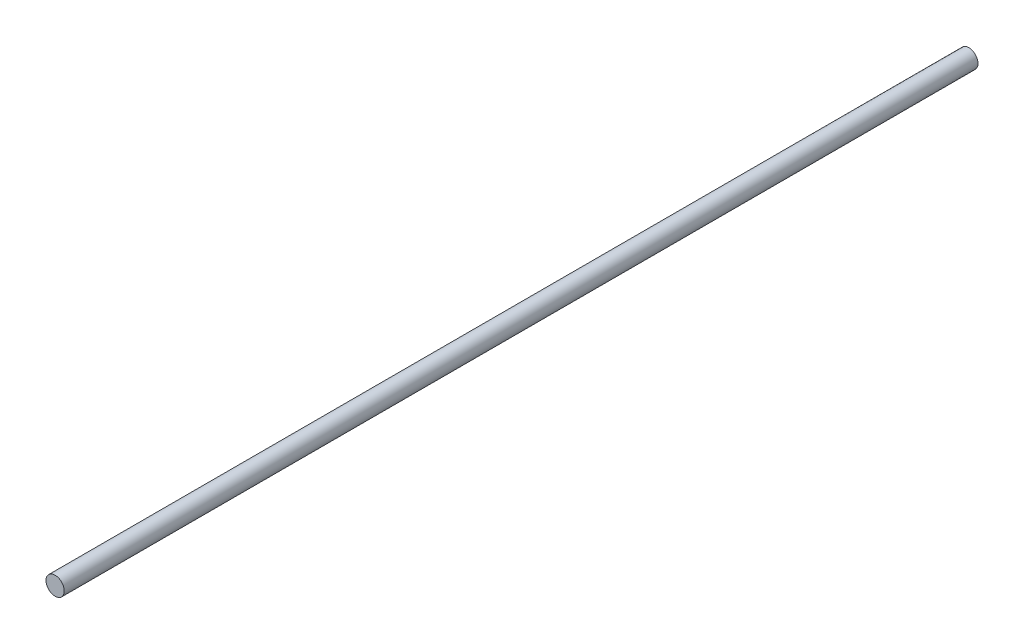
ISO-10303-21;
HEADER;
FILE_DESCRIPTION(('STEP AP214'),'2;1');
FILE_NAME('part.step','',(''),(''),'','','');
FILE_SCHEMA(('AUTOMOTIVE_DESIGN { 1 0 10303 214 1 1 1 1 }'));
ENDSEC;
DATA;
#1=APPLICATION_CONTEXT('core data for automotive mechanical design processes');
#2=APPLICATION_PROTOCOL_DEFINITION('international standard','automotive_design',2000,#1);
#3=PRODUCT_CONTEXT('',#1,'mechanical');
#4=PRODUCT('Part','Part','',(#3));
#5=PRODUCT_RELATED_PRODUCT_CATEGORY('part','',(#4));
#6=PRODUCT_DEFINITION_FORMATION('','',#4);
#7=PRODUCT_DEFINITION_CONTEXT('part definition',#1,'design');
#8=PRODUCT_DEFINITION('design','',#6,#7);
#9=PRODUCT_DEFINITION_SHAPE('','',#8);
#10=(LENGTH_UNIT() NAMED_UNIT(*) SI_UNIT(.MILLI.,.METRE.));
#11=(NAMED_UNIT(*) PLANE_ANGLE_UNIT() SI_UNIT($,.RADIAN.));
#12=(NAMED_UNIT(*) SI_UNIT($,.STERADIAN.) SOLID_ANGLE_UNIT());
#13=UNCERTAINTY_MEASURE_WITH_UNIT(LENGTH_MEASURE(1.E-05),#10,'distance_accuracy_value','');
#14=(GEOMETRIC_REPRESENTATION_CONTEXT(3) GLOBAL_UNCERTAINTY_ASSIGNED_CONTEXT((#13)) GLOBAL_UNIT_ASSIGNED_CONTEXT((#10,
#11,#12)) REPRESENTATION_CONTEXT('',''));
#15=CARTESIAN_POINT('',(0.,0.,0.));
#16=DIRECTION('',(0.,0.,1.));
#17=DIRECTION('',(1.,0.,0.));
#18=AXIS2_PLACEMENT_3D('',#15,#16,#17);
#19=CARTESIAN_POINT('',(0.,0.,400.));
#20=DIRECTION('',(0.,0.,-1.));
#21=DIRECTION('',(-1.,0.,0.));
#22=AXIS2_PLACEMENT_3D('',#19,#20,#21);
#23=CYLINDRICAL_SURFACE('',#22,4.);
#24=CARTESIAN_POINT('',(0.,0.,400.));
#25=DIRECTION('',(0.,0.,1.));
#26=DIRECTION('',(1.,0.,0.));
#27=AXIS2_PLACEMENT_3D('',#24,#25,#26);
#28=CIRCLE('',#27,4.);
#29=CARTESIAN_POINT('',(4.,0.,400.));
#30=VERTEX_POINT('',#29);
#31=EDGE_CURVE('E10',#30,#30,#28,.T.);
#32=ORIENTED_EDGE('',*,*,#31,.F.);
#33=EDGE_LOOP('',(#32));
#34=FACE_BOUND('',#33,.T.);
#35=CARTESIAN_POINT('',(0.,0.,0.));
#36=DIRECTION('',(0.,0.,1.));
#37=DIRECTION('',(1.,0.,0.));
#38=AXIS2_PLACEMENT_3D('',#35,#36,#37);
#39=CIRCLE('',#38,4.);
#40=CARTESIAN_POINT('',(4.,0.,0.));
#41=VERTEX_POINT('',#40);
#42=EDGE_CURVE('E34',#41,#41,#39,.T.);
#43=ORIENTED_EDGE('',*,*,#42,.T.);
#44=EDGE_LOOP('',(#43));
#45=FACE_BOUND('',#44,.T.);
#46=ADVANCED_FACE('F31',(#34,#45),#23,.T.);
#47=CARTESIAN_POINT('',(0.,0.,400.));
#48=DIRECTION('',(0.,0.,1.));
#49=DIRECTION('',(1.,0.,0.));
#50=AXIS2_PLACEMENT_3D('',#47,#48,#49);
#51=PLANE('',#50);
#52=ORIENTED_EDGE('',*,*,#31,.T.);
#53=EDGE_LOOP('',(#52));
#54=FACE_BOUND('',#53,.T.);
#55=ADVANCED_FACE('F46',(#54),#51,.T.);
#56=CARTESIAN_POINT('',(0.,0.,0.));
#57=DIRECTION('',(0.,0.,1.));
#58=DIRECTION('',(1.,0.,0.));
#59=AXIS2_PLACEMENT_3D('',#56,#57,#58);
#60=PLANE('',#59);
#61=ORIENTED_EDGE('',*,*,#42,.F.);
#62=EDGE_LOOP('',(#61));
#63=FACE_BOUND('',#62,.T.);
#64=ADVANCED_FACE('F44',(#63),#60,.F.);
#65=CLOSED_SHELL('',(#46,#55,#64));
#66=MANIFOLD_SOLID_BREP('B2',#65);
#67=ADVANCED_BREP_SHAPE_REPRESENTATION('',(#18,#66),#14);
#68=SHAPE_DEFINITION_REPRESENTATION(#9,#67);
ENDSEC;
END-ISO-10303-21;
